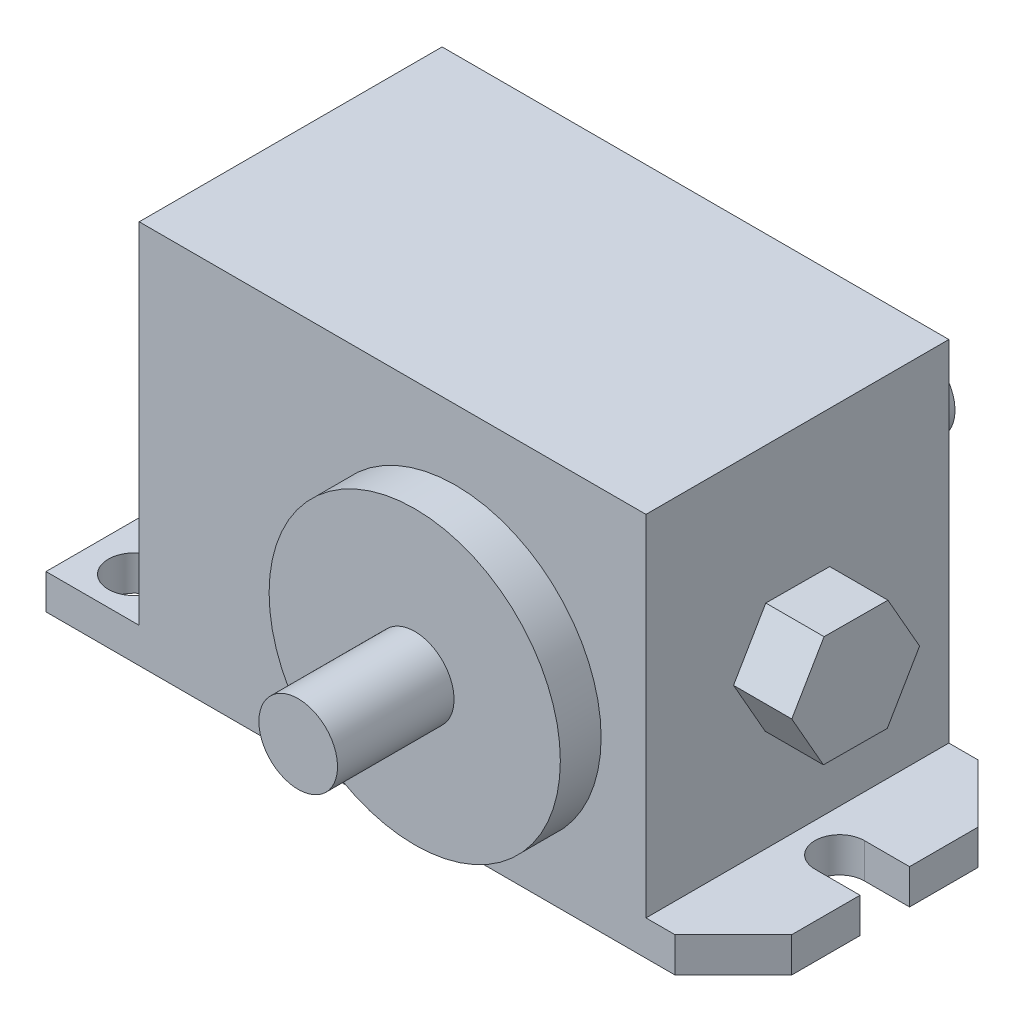
ISO-10303-21;
HEADER;
FILE_DESCRIPTION(('STEP AP214'),'2;1');
FILE_NAME('part.step','',(''),(''),'','','');
FILE_SCHEMA(('AUTOMOTIVE_DESIGN { 1 0 10303 214 1 1 1 1 }'));
ENDSEC;
DATA;
#1=APPLICATION_CONTEXT('core data for automotive mechanical design processes');
#2=APPLICATION_PROTOCOL_DEFINITION('international standard','automotive_design',2000,#1);
#3=PRODUCT_CONTEXT('',#1,'mechanical');
#4=PRODUCT('Part','Part','',(#3));
#5=PRODUCT_RELATED_PRODUCT_CATEGORY('part','',(#4));
#6=PRODUCT_DEFINITION_FORMATION('','',#4);
#7=PRODUCT_DEFINITION_CONTEXT('part definition',#1,'design');
#8=PRODUCT_DEFINITION('design','',#6,#7);
#9=PRODUCT_DEFINITION_SHAPE('','',#8);
#10=(LENGTH_UNIT() NAMED_UNIT(*) SI_UNIT(.MILLI.,.METRE.));
#11=(NAMED_UNIT(*) PLANE_ANGLE_UNIT() SI_UNIT($,.RADIAN.));
#12=(NAMED_UNIT(*) SI_UNIT($,.STERADIAN.) SOLID_ANGLE_UNIT());
#13=UNCERTAINTY_MEASURE_WITH_UNIT(LENGTH_MEASURE(1.E-05),#10,'distance_accuracy_value','');
#14=(GEOMETRIC_REPRESENTATION_CONTEXT(3) GLOBAL_UNCERTAINTY_ASSIGNED_CONTEXT((#13)) GLOBAL_UNIT_ASSIGNED_CONTEXT((#10,
#11,#12)) REPRESENTATION_CONTEXT('',''));
#15=CARTESIAN_POINT('',(0.,0.,0.));
#16=DIRECTION('',(0.,0.,1.));
#17=DIRECTION('',(1.,0.,0.));
#18=AXIS2_PLACEMENT_3D('',#15,#16,#17);
#19=CARTESIAN_POINT('',(49.,66.,-26.));
#20=DIRECTION('',(-1.,0.,0.));
#21=DIRECTION('',(0.,0.,1.));
#22=AXIS2_PLACEMENT_3D('',#19,#20,#21);
#23=PLANE('',#22);
#24=DIRECTION('',(0.,0.,-1.));
#25=VECTOR('',#24,1.);
#26=CARTESIAN_POINT('',(49.,6.,-26.));
#27=LINE('',#26,#25);
#28=CARTESIAN_POINT('',(49.,6.,26.));
#29=VERTEX_POINT('',#28);
#30=CARTESIAN_POINT('',(49.,6.,-26.));
#31=VERTEX_POINT('',#30);
#32=EDGE_CURVE('E225',#29,#31,#27,.T.);
#33=ORIENTED_EDGE('',*,*,#32,.T.);
#34=DIRECTION('',(0.,-1.,0.));
#35=VECTOR('',#34,1.);
#36=CARTESIAN_POINT('',(49.,66.,-26.));
#37=LINE('',#36,#35);
#38=CARTESIAN_POINT('',(49.,66.,-26.));
#39=VERTEX_POINT('',#38);
#40=EDGE_CURVE('E238',#39,#31,#37,.T.);
#41=ORIENTED_EDGE('',*,*,#40,.F.);
#42=DIRECTION('',(0.,0.,-1.));
#43=VECTOR('',#42,1.);
#44=CARTESIAN_POINT('',(49.,66.,-26.));
#45=LINE('',#44,#43);
#46=CARTESIAN_POINT('',(49.,66.,26.));
#47=VERTEX_POINT('',#46);
#48=EDGE_CURVE('E227',#47,#39,#45,.T.);
#49=ORIENTED_EDGE('',*,*,#48,.F.);
#50=DIRECTION('',(0.,-1.,0.));
#51=VECTOR('',#50,1.);
#52=CARTESIAN_POINT('',(49.,66.,26.));
#53=LINE('',#52,#51);
#54=EDGE_CURVE('E241',#47,#29,#53,.T.);
#55=ORIENTED_EDGE('',*,*,#54,.T.);
#56=EDGE_LOOP('',(#33,#41,#49,#55));
#57=FACE_BOUND('',#56,.T.);
#58=DIRECTION('',(0.,-0.00587887836475411,-0.999982719245274));
#59=VECTOR('',#58,1.);
#60=CARTESIAN_POINT('',(49.,23.5324088012309,5.54058211980687));
#61=LINE('',#60,#59);
#62=CARTESIAN_POINT('',(49.,23.5324088012309,5.54058211980687));
#63=VERTEX_POINT('',#62);
#64=CARTESIAN_POINT('',(49.,23.4679195331089,-5.42888343087658));
#65=VERTEX_POINT('',#64);
#66=EDGE_CURVE('E194',#63,#65,#61,.T.);
#67=ORIENTED_EDGE('',*,*,#66,.F.);
#68=DIRECTION('',(0.,-0.868949877394226,-0.494900101613001));
#69=VECTOR('',#68,1.);
#70=CARTESIAN_POINT('',(49.,33.064489268122,10.9694655506834));
#71=LINE('',#70,#69);
#72=CARTESIAN_POINT('',(49.,33.064489268122,10.9694655506834));
#73=VERTEX_POINT('',#72);
#74=EDGE_CURVE('E191',#73,#63,#71,.T.);
#75=ORIENTED_EDGE('',*,*,#74,.F.);
#76=DIRECTION('',(0.,-0.863070999029473,0.505082617632271));
#77=VECTOR('',#76,1.);
#78=CARTESIAN_POINT('',(49.,42.5320804668911,5.42888343087655));
#79=LINE('',#78,#77);
#80=CARTESIAN_POINT('',(49.,42.5320804668911,5.42888343087654));
#81=VERTEX_POINT('',#80);
#82=EDGE_CURVE('E643',#81,#73,#79,.T.);
#83=ORIENTED_EDGE('',*,*,#82,.F.);
#84=DIRECTION('',(0.,0.00587887836475347,0.999982719245274));
#85=VECTOR('',#84,1.);
#86=CARTESIAN_POINT('',(49.,42.4675911987691,-5.54058211980689));
#87=LINE('',#86,#85);
#88=CARTESIAN_POINT('',(49.,42.4675911987691,-5.54058211980689));
#89=VERTEX_POINT('',#88);
#90=EDGE_CURVE('E658',#89,#81,#87,.T.);
#91=ORIENTED_EDGE('',*,*,#90,.F.);
#92=DIRECTION('',(0.,0.868949877394226,0.494900101613002));
#93=VECTOR('',#92,1.);
#94=CARTESIAN_POINT('',(49.,32.935510731878,-10.9694655506834));
#95=LINE('',#94,#93);
#96=CARTESIAN_POINT('',(49.,32.935510731878,-10.9694655506834));
#97=VERTEX_POINT('',#96);
#98=EDGE_CURVE('E57',#97,#89,#95,.T.);
#99=ORIENTED_EDGE('',*,*,#98,.F.);
#100=DIRECTION('',(0.,0.863070999029473,-0.505082617632271));
#101=VECTOR('',#100,1.);
#102=CARTESIAN_POINT('',(49.,23.4679195331089,-5.42888343087657));
#103=LINE('',#102,#101);
#104=EDGE_CURVE('E52',#65,#97,#103,.T.);
#105=ORIENTED_EDGE('',*,*,#104,.F.);
#106=EDGE_LOOP('',(#67,#75,#83,#91,#99,#105));
#107=FACE_BOUND('',#106,.T.);
#108=ADVANCED_FACE('F35',(#57,#107),#23,.F.);
#109=CARTESIAN_POINT('',(0.,6.,0.));
#110=DIRECTION('',(0.,1.,0.));
#111=DIRECTION('',(0.,0.,1.));
#112=AXIS2_PLACEMENT_3D('',#109,#110,#111);
#113=PLANE('',#112);
#114=DIRECTION('',(0.,0.,1.));
#115=VECTOR('',#114,1.);
#116=CARTESIAN_POINT('',(-38.,6.,-26.));
#117=LINE('',#116,#115);
#118=CARTESIAN_POINT('',(-38.,6.,-26.));
#119=VERTEX_POINT('',#118);
#120=CARTESIAN_POINT('',(-38.,6.,26.));
#121=VERTEX_POINT('',#120);
#122=EDGE_CURVE('E218',#119,#121,#117,.T.);
#123=ORIENTED_EDGE('',*,*,#122,.F.);
#124=DIRECTION('',(1.,0.,0.));
#125=VECTOR('',#124,1.);
#126=CARTESIAN_POINT('',(0.,6.,-26.));
#127=LINE('',#126,#125);
#128=CARTESIAN_POINT('',(-54.,6.,-26.));
#129=VERTEX_POINT('',#128);
#130=EDGE_CURVE('E269',#129,#119,#127,.T.);
#131=ORIENTED_EDGE('',*,*,#130,.F.);
#132=DIRECTION('',(0.,0.,1.));
#133=VECTOR('',#132,1.);
#134=CARTESIAN_POINT('',(-54.,6.,0.));
#135=LINE('',#134,#133);
#136=CARTESIAN_POINT('',(-54.,6.,26.));
#137=VERTEX_POINT('',#136);
#138=EDGE_CURVE('E272',#129,#137,#135,.T.);
#139=ORIENTED_EDGE('',*,*,#138,.T.);
#140=DIRECTION('',(1.,0.,0.));
#141=VECTOR('',#140,1.);
#142=CARTESIAN_POINT('',(0.,6.,26.));
#143=LINE('',#142,#141);
#144=EDGE_CURVE('E276',#137,#121,#143,.T.);
#145=ORIENTED_EDGE('',*,*,#144,.T.);
#146=EDGE_LOOP('',(#123,#131,#139,#145));
#147=FACE_BOUND('',#146,.T.);
#148=CARTESIAN_POINT('',(-46.,6.,18.8));
#149=DIRECTION('',(0.,1.,0.));
#150=DIRECTION('',(0.,0.,1.));
#151=AXIS2_PLACEMENT_3D('',#148,#149,#150);
#152=CIRCLE('',#151,4.5);
#153=CARTESIAN_POINT('',(-46.,6.,23.3));
#154=VERTEX_POINT('',#153);
#155=EDGE_CURVE('E248',#154,#154,#152,.T.);
#156=ORIENTED_EDGE('',*,*,#155,.F.);
#157=EDGE_LOOP('',(#156));
#158=FACE_BOUND('',#157,.T.);
#159=CARTESIAN_POINT('',(-46.,6.,-18.8));
#160=DIRECTION('',(0.,1.,0.));
#161=DIRECTION('',(0.,0.,1.));
#162=AXIS2_PLACEMENT_3D('',#159,#160,#161);
#163=CIRCLE('',#162,4.5);
#164=CARTESIAN_POINT('',(-46.,6.,-14.3));
#165=VERTEX_POINT('',#164);
#166=EDGE_CURVE('E251',#165,#165,#163,.T.);
#167=ORIENTED_EDGE('',*,*,#166,.F.);
#168=EDGE_LOOP('',(#167));
#169=FACE_BOUND('',#168,.T.);
#170=ADVANCED_FACE('F407',(#147,#158,#169),#113,.T.);
#171=CARTESIAN_POINT('',(56.25,6.,0.));
#172=DIRECTION('',(0.,-1.,0.));
#173=DIRECTION('',(0.,0.,-1.));
#174=AXIS2_PLACEMENT_3D('',#171,#172,#173);
#175=CYLINDRICAL_SURFACE('',#174,4.25);
#176=CARTESIAN_POINT('',(56.25,0.,0.));
#177=DIRECTION('',(0.,1.,0.));
#178=DIRECTION('',(0.,0.,1.));
#179=AXIS2_PLACEMENT_3D('',#176,#177,#178);
#180=CIRCLE('',#179,4.25);
#181=CARTESIAN_POINT('',(56.25,0.,-4.25));
#182=VERTEX_POINT('',#181);
#183=CARTESIAN_POINT('',(56.25,0.,4.25));
#184=VERTEX_POINT('',#183);
#185=EDGE_CURVE('E289',#182,#184,#180,.T.);
#186=ORIENTED_EDGE('',*,*,#185,.F.);
#187=DIRECTION('',(0.,-1.,0.));
#188=VECTOR('',#187,1.);
#189=CARTESIAN_POINT('',(56.25,6.,-4.25));
#190=LINE('',#189,#188);
#191=CARTESIAN_POINT('',(56.25,6.,-4.25));
#192=VERTEX_POINT('',#191);
#193=EDGE_CURVE('E39',#192,#182,#190,.T.);
#194=ORIENTED_EDGE('',*,*,#193,.F.);
#195=CARTESIAN_POINT('',(56.25,6.,0.));
#196=DIRECTION('',(0.,1.,0.));
#197=DIRECTION('',(0.,0.,1.));
#198=AXIS2_PLACEMENT_3D('',#195,#196,#197);
#199=CIRCLE('',#198,4.25);
#200=CARTESIAN_POINT('',(56.25,6.,4.25));
#201=VERTEX_POINT('',#200);
#202=EDGE_CURVE('E255',#192,#201,#199,.T.);
#203=ORIENTED_EDGE('',*,*,#202,.T.);
#204=DIRECTION('',(0.,-1.,0.));
#205=VECTOR('',#204,1.);
#206=CARTESIAN_POINT('',(56.25,6.,4.25));
#207=LINE('',#206,#205);
#208=EDGE_CURVE('E283',#201,#184,#207,.T.);
#209=ORIENTED_EDGE('',*,*,#208,.T.);
#210=EDGE_LOOP('',(#186,#194,#203,#209));
#211=FACE_BOUND('',#210,.T.);
#212=ADVANCED_FACE('F342',(#211),#175,.F.);
#213=CARTESIAN_POINT('',(0.,6.,-4.24999999999999));
#214=DIRECTION('',(0.,0.,1.));
#215=DIRECTION('',(1.,0.,0.));
#216=AXIS2_PLACEMENT_3D('',#213,#214,#215);
#217=PLANE('',#216);
#218=DIRECTION('',(-1.,0.,0.));
#219=VECTOR('',#218,1.);
#220=CARTESIAN_POINT('',(0.,0.,-4.24999999999999));
#221=LINE('',#220,#219);
#222=CARTESIAN_POINT('',(64.,0.,-4.25));
#223=VERTEX_POINT('',#222);
#224=EDGE_CURVE('E292',#223,#182,#221,.T.);
#225=ORIENTED_EDGE('',*,*,#224,.F.);
#226=DIRECTION('',(0.,-1.,0.));
#227=VECTOR('',#226,1.);
#228=CARTESIAN_POINT('',(64.,6.,-4.25));
#229=LINE('',#228,#227);
#230=CARTESIAN_POINT('',(64.,6.,-4.25));
#231=VERTEX_POINT('',#230);
#232=EDGE_CURVE('E332',#231,#223,#229,.T.);
#233=ORIENTED_EDGE('',*,*,#232,.F.);
#234=DIRECTION('',(-1.,0.,0.));
#235=VECTOR('',#234,1.);
#236=CARTESIAN_POINT('',(0.,6.,-4.24999999999999));
#237=LINE('',#236,#235);
#238=EDGE_CURVE('E258',#231,#192,#237,.T.);
#239=ORIENTED_EDGE('',*,*,#238,.T.);
#240=ORIENTED_EDGE('',*,*,#193,.T.);
#241=EDGE_LOOP('',(#225,#233,#239,#240));
#242=FACE_BOUND('',#241,.T.);
#243=ADVANCED_FACE('F338',(#242),#217,.T.);
#244=CARTESIAN_POINT('',(64.,6.,0.));
#245=DIRECTION('',(1.,0.,0.));
#246=DIRECTION('',(0.,0.,-1.));
#247=AXIS2_PLACEMENT_3D('',#244,#245,#246);
#248=PLANE('',#247);
#249=DIRECTION('',(0.,0.,1.));
#250=VECTOR('',#249,1.);
#251=CARTESIAN_POINT('',(64.,0.,0.));
#252=LINE('',#251,#250);
#253=CARTESIAN_POINT('',(64.,0.,-16.));
#254=VERTEX_POINT('',#253);
#255=EDGE_CURVE('E295',#254,#223,#252,.T.);
#256=ORIENTED_EDGE('',*,*,#255,.F.);
#257=DIRECTION('',(0.,-1.,0.));
#258=VECTOR('',#257,1.);
#259=CARTESIAN_POINT('',(64.,6.,-16.));
#260=LINE('',#259,#258);
#261=CARTESIAN_POINT('',(64.,6.,-16.));
#262=VERTEX_POINT('',#261);
#263=EDGE_CURVE('E331',#262,#254,#260,.T.);
#264=ORIENTED_EDGE('',*,*,#263,.F.);
#265=DIRECTION('',(0.,0.,1.));
#266=VECTOR('',#265,1.);
#267=CARTESIAN_POINT('',(64.,6.,0.));
#268=LINE('',#267,#266);
#269=EDGE_CURVE('E261',#262,#231,#268,.T.);
#270=ORIENTED_EDGE('',*,*,#269,.T.);
#271=ORIENTED_EDGE('',*,*,#232,.T.);
#272=EDGE_LOOP('',(#256,#264,#270,#271));
#273=FACE_BOUND('',#272,.T.);
#274=ADVANCED_FACE('F347',(#273),#248,.T.);
#275=CARTESIAN_POINT('',(40.,6.,-40.));
#276=DIRECTION('',(0.707106781186548,0.,-0.707106781186547));
#277=DIRECTION('',(-0.707106781186547,0.,-0.707106781186548));
#278=AXIS2_PLACEMENT_3D('',#275,#276,#277);
#279=PLANE('',#278);
#280=DIRECTION('',(0.707106781186547,0.,0.707106781186548));
#281=VECTOR('',#280,1.);
#282=CARTESIAN_POINT('',(40.,0.,-40.));
#283=LINE('',#282,#281);
#284=CARTESIAN_POINT('',(54.,0.,-26.));
#285=VERTEX_POINT('',#284);
#286=EDGE_CURVE('E298',#285,#254,#283,.T.);
#287=ORIENTED_EDGE('',*,*,#286,.F.);
#288=DIRECTION('',(0.,-1.,0.));
#289=VECTOR('',#288,1.);
#290=CARTESIAN_POINT('',(54.,6.,-26.));
#291=LINE('',#290,#289);
#292=CARTESIAN_POINT('',(54.,6.,-26.));
#293=VERTEX_POINT('',#292);
#294=EDGE_CURVE('E329',#293,#285,#291,.T.);
#295=ORIENTED_EDGE('',*,*,#294,.F.);
#296=DIRECTION('',(0.707106781186547,0.,0.707106781186548));
#297=VECTOR('',#296,1.);
#298=CARTESIAN_POINT('',(40.,6.,-40.));
#299=LINE('',#298,#297);
#300=EDGE_CURVE('E264',#293,#262,#299,.T.);
#301=ORIENTED_EDGE('',*,*,#300,.T.);
#302=ORIENTED_EDGE('',*,*,#263,.T.);
#303=EDGE_LOOP('',(#287,#295,#301,#302));
#304=FACE_BOUND('',#303,.T.);
#305=ADVANCED_FACE('F354',(#304),#279,.T.);
#306=CARTESIAN_POINT('',(0.,6.,-26.));
#307=DIRECTION('',(0.,0.,-1.));
#308=DIRECTION('',(-1.,0.,0.));
#309=AXIS2_PLACEMENT_3D('',#306,#307,#308);
#310=PLANE('',#309);
#311=CARTESIAN_POINT('',(16.3,29.,-26.));
#312=DIRECTION('',(0.,0.,-1.));
#313=DIRECTION('',(-1.,0.,0.));
#314=AXIS2_PLACEMENT_3D('',#311,#312,#313);
#315=CIRCLE('',#314,25.);
#316=CARTESIAN_POINT('',(-8.70000000000001,29.,-26.));
#317=VERTEX_POINT('',#316);
#318=EDGE_CURVE('E44',#317,#317,#315,.T.);
#319=ORIENTED_EDGE('',*,*,#318,.F.);
#320=EDGE_LOOP('',(#319));
#321=FACE_BOUND('',#320,.T.);
#322=DIRECTION('',(1.,0.,0.));
#323=VECTOR('',#322,1.);
#324=CARTESIAN_POINT('',(0.,0.,-26.));
#325=LINE('',#324,#323);
#326=CARTESIAN_POINT('',(-54.,0.,-26.));
#327=VERTEX_POINT('',#326);
#328=EDGE_CURVE('E302',#327,#285,#325,.T.);
#329=ORIENTED_EDGE('',*,*,#328,.F.);
#330=DIRECTION('',(0.,-1.,0.));
#331=VECTOR('',#330,1.);
#332=CARTESIAN_POINT('',(-54.,6.,-26.));
#333=LINE('',#332,#331);
#334=EDGE_CURVE('E327',#129,#327,#333,.T.);
#335=ORIENTED_EDGE('',*,*,#334,.F.);
#336=ORIENTED_EDGE('',*,*,#130,.T.);
#337=DIRECTION('',(0.,-1.,0.));
#338=VECTOR('',#337,1.);
#339=CARTESIAN_POINT('',(-38.,66.,-26.));
#340=LINE('',#339,#338);
#341=CARTESIAN_POINT('',(-38.,66.,-26.));
#342=VERTEX_POINT('',#341);
#343=EDGE_CURVE('E231',#342,#119,#340,.T.);
#344=ORIENTED_EDGE('',*,*,#343,.F.);
#345=DIRECTION('',(-1.,0.,0.));
#346=VECTOR('',#345,1.);
#347=CARTESIAN_POINT('',(-38.,66.,-26.));
#348=LINE('',#347,#346);
#349=EDGE_CURVE('E229',#39,#342,#348,.T.);
#350=ORIENTED_EDGE('',*,*,#349,.F.);
#351=ORIENTED_EDGE('',*,*,#40,.T.);
#352=EDGE_CURVE('E268',#31,#293,#127,.T.);
#353=ORIENTED_EDGE('',*,*,#352,.T.);
#354=ORIENTED_EDGE('',*,*,#294,.T.);
#355=EDGE_LOOP('',(#329,#335,#336,#344,#350,#351,#353,#354));
#356=FACE_BOUND('',#355,.T.);
#357=ADVANCED_FACE('F357',(#321,#356),#310,.T.);
#358=CARTESIAN_POINT('',(-54.,6.,0.));
#359=DIRECTION('',(1.,0.,0.));
#360=DIRECTION('',(0.,0.,-1.));
#361=AXIS2_PLACEMENT_3D('',#358,#359,#360);
#362=PLANE('',#361);
#363=DIRECTION('',(0.,0.,1.));
#364=VECTOR('',#363,1.);
#365=CARTESIAN_POINT('',(-54.,0.,0.));
#366=LINE('',#365,#364);
#367=CARTESIAN_POINT('',(-54.,0.,26.));
#368=VERTEX_POINT('',#367);
#369=EDGE_CURVE('E305',#327,#368,#366,.T.);
#370=ORIENTED_EDGE('',*,*,#369,.T.);
#371=DIRECTION('',(0.,-1.,0.));
#372=VECTOR('',#371,1.);
#373=CARTESIAN_POINT('',(-54.,6.,26.));
#374=LINE('',#373,#372);
#375=EDGE_CURVE('E324',#137,#368,#374,.T.);
#376=ORIENTED_EDGE('',*,*,#375,.F.);
#377=ORIENTED_EDGE('',*,*,#138,.F.);
#378=ORIENTED_EDGE('',*,*,#334,.T.);
#379=EDGE_LOOP('',(#370,#376,#377,#378));
#380=FACE_BOUND('',#379,.T.);
#381=ADVANCED_FACE('F384',(#380),#362,.F.);
#382=CARTESIAN_POINT('',(0.,6.,26.));
#383=DIRECTION('',(0.,0.,-1.));
#384=DIRECTION('',(-1.,0.,0.));
#385=AXIS2_PLACEMENT_3D('',#382,#383,#384);
#386=PLANE('',#385);
#387=CARTESIAN_POINT('',(16.3,29.,26.));
#388=DIRECTION('',(0.,0.,-1.));
#389=DIRECTION('',(-1.,0.,0.));
#390=AXIS2_PLACEMENT_3D('',#387,#388,#389);
#391=CIRCLE('',#390,25.);
#392=CARTESIAN_POINT('',(-8.70000000000001,29.,26.));
#393=VERTEX_POINT('',#392);
#394=EDGE_CURVE('E205',#393,#393,#391,.T.);
#395=ORIENTED_EDGE('',*,*,#394,.T.);
#396=EDGE_LOOP('',(#395));
#397=FACE_BOUND('',#396,.T.);
#398=DIRECTION('',(1.,0.,0.));
#399=VECTOR('',#398,1.);
#400=CARTESIAN_POINT('',(0.,0.,26.));
#401=LINE('',#400,#399);
#402=CARTESIAN_POINT('',(54.,0.,26.));
#403=VERTEX_POINT('',#402);
#404=EDGE_CURVE('E308',#368,#403,#401,.T.);
#405=ORIENTED_EDGE('',*,*,#404,.T.);
#406=DIRECTION('',(0.,-1.,0.));
#407=VECTOR('',#406,1.);
#408=CARTESIAN_POINT('',(54.,6.,26.));
#409=LINE('',#408,#407);
#410=CARTESIAN_POINT('',(54.,6.,26.));
#411=VERTEX_POINT('',#410);
#412=EDGE_CURVE('E321',#411,#403,#409,.T.);
#413=ORIENTED_EDGE('',*,*,#412,.F.);
#414=EDGE_CURVE('E275',#29,#411,#143,.T.);
#415=ORIENTED_EDGE('',*,*,#414,.F.);
#416=ORIENTED_EDGE('',*,*,#54,.F.);
#417=DIRECTION('',(1.,0.,0.));
#418=VECTOR('',#417,1.);
#419=CARTESIAN_POINT('',(-38.,66.,26.));
#420=LINE('',#419,#418);
#421=CARTESIAN_POINT('',(-38.,66.,26.));
#422=VERTEX_POINT('',#421);
#423=EDGE_CURVE('E224',#422,#47,#420,.T.);
#424=ORIENTED_EDGE('',*,*,#423,.F.);
#425=DIRECTION('',(0.,-1.,0.));
#426=VECTOR('',#425,1.);
#427=CARTESIAN_POINT('',(-38.,66.,26.));
#428=LINE('',#427,#426);
#429=EDGE_CURVE('E244',#422,#121,#428,.T.);
#430=ORIENTED_EDGE('',*,*,#429,.T.);
#431=ORIENTED_EDGE('',*,*,#144,.F.);
#432=ORIENTED_EDGE('',*,*,#375,.T.);
#433=EDGE_LOOP('',(#405,#413,#415,#416,#424,#430,#431,#432));
#434=FACE_BOUND('',#433,.T.);
#435=ADVANCED_FACE('F365',(#397,#434),#386,.F.);
#436=CARTESIAN_POINT('',(40.,6.,40.));
#437=DIRECTION('',(-0.707106781186547,0.,-0.707106781186547));
#438=DIRECTION('',(-0.707106781186548,0.,0.707106781186548));
#439=AXIS2_PLACEMENT_3D('',#436,#437,#438);
#440=PLANE('',#439);
#441=DIRECTION('',(0.707106781186548,0.,-0.707106781186548));
#442=VECTOR('',#441,1.);
#443=CARTESIAN_POINT('',(40.,0.,40.));
#444=LINE('',#443,#442);
#445=CARTESIAN_POINT('',(64.,0.,16.));
#446=VERTEX_POINT('',#445);
#447=EDGE_CURVE('E311',#403,#446,#444,.T.);
#448=ORIENTED_EDGE('',*,*,#447,.T.);
#449=DIRECTION('',(0.,-1.,0.));
#450=VECTOR('',#449,1.);
#451=CARTESIAN_POINT('',(64.,6.,16.));
#452=LINE('',#451,#450);
#453=CARTESIAN_POINT('',(64.,6.,16.));
#454=VERTEX_POINT('',#453);
#455=EDGE_CURVE('E319',#454,#446,#452,.T.);
#456=ORIENTED_EDGE('',*,*,#455,.F.);
#457=DIRECTION('',(0.707106781186548,0.,-0.707106781186548));
#458=VECTOR('',#457,1.);
#459=CARTESIAN_POINT('',(40.,6.,40.));
#460=LINE('',#459,#458);
#461=EDGE_CURVE('E278',#411,#454,#460,.T.);
#462=ORIENTED_EDGE('',*,*,#461,.F.);
#463=ORIENTED_EDGE('',*,*,#412,.T.);
#464=EDGE_LOOP('',(#448,#456,#462,#463));
#465=FACE_BOUND('',#464,.T.);
#466=ADVANCED_FACE('F371',(#465),#440,.F.);
#467=CARTESIAN_POINT('',(64.,0.,4.25));
#468=VERTEX_POINT('',#467);
#469=EDGE_CURVE('E299',#468,#446,#252,.T.);
#470=ORIENTED_EDGE('',*,*,#469,.F.);
#471=DIRECTION('',(0.,-1.,0.));
#472=VECTOR('',#471,1.);
#473=CARTESIAN_POINT('',(64.,6.,4.25));
#474=LINE('',#473,#472);
#475=CARTESIAN_POINT('',(64.,6.,4.25));
#476=VERTEX_POINT('',#475);
#477=EDGE_CURVE('E317',#476,#468,#474,.T.);
#478=ORIENTED_EDGE('',*,*,#477,.F.);
#479=EDGE_CURVE('E265',#476,#454,#268,.T.);
#480=ORIENTED_EDGE('',*,*,#479,.T.);
#481=ORIENTED_EDGE('',*,*,#455,.T.);
#482=EDGE_LOOP('',(#470,#478,#480,#481));
#483=FACE_BOUND('',#482,.T.);
#484=ADVANCED_FACE('F376',(#483),#248,.T.);
#485=CARTESIAN_POINT('',(-46.,6.,-18.8));
#486=DIRECTION('',(0.,-1.,0.));
#487=DIRECTION('',(0.,0.,-1.));
#488=AXIS2_PLACEMENT_3D('',#485,#486,#487);
#489=CYLINDRICAL_SURFACE('',#488,4.5);
#490=ORIENTED_EDGE('',*,*,#166,.T.);
#491=EDGE_LOOP('',(#490));
#492=FACE_BOUND('',#491,.T.);
#493=CARTESIAN_POINT('',(-46.,0.,-18.8));
#494=DIRECTION('',(0.,1.,0.));
#495=DIRECTION('',(0.,0.,1.));
#496=AXIS2_PLACEMENT_3D('',#493,#494,#495);
#497=CIRCLE('',#496,4.5);
#498=CARTESIAN_POINT('',(-46.,0.,-14.3));
#499=VERTEX_POINT('',#498);
#500=EDGE_CURVE('E286',#499,#499,#497,.T.);
#501=ORIENTED_EDGE('',*,*,#500,.F.);
#502=EDGE_LOOP('',(#501));
#503=FACE_BOUND('',#502,.T.);
#504=ADVANCED_FACE('F421',(#492,#503),#489,.F.);
#505=CARTESIAN_POINT('',(-46.,6.,18.8));
#506=DIRECTION('',(0.,-1.,0.));
#507=DIRECTION('',(0.,0.,-1.));
#508=AXIS2_PLACEMENT_3D('',#505,#506,#507);
#509=CYLINDRICAL_SURFACE('',#508,4.5);
#510=ORIENTED_EDGE('',*,*,#155,.T.);
#511=EDGE_LOOP('',(#510));
#512=FACE_BOUND('',#511,.T.);
#513=CARTESIAN_POINT('',(-46.,0.,18.8));
#514=DIRECTION('',(0.,1.,0.));
#515=DIRECTION('',(0.,0.,1.));
#516=AXIS2_PLACEMENT_3D('',#513,#514,#515);
#517=CIRCLE('',#516,4.5);
#518=CARTESIAN_POINT('',(-46.,0.,23.3));
#519=VERTEX_POINT('',#518);
#520=EDGE_CURVE('E247',#519,#519,#517,.T.);
#521=ORIENTED_EDGE('',*,*,#520,.F.);
#522=EDGE_LOOP('',(#521));
#523=FACE_BOUND('',#522,.T.);
#524=ADVANCED_FACE('F37',(#512,#523),#509,.F.);
#525=CARTESIAN_POINT('',(0.,6.,4.25000000000001));
#526=DIRECTION('',(0.,0.,-1.));
#527=DIRECTION('',(-1.,0.,0.));
#528=AXIS2_PLACEMENT_3D('',#525,#526,#527);
#529=PLANE('',#528);
#530=DIRECTION('',(1.,0.,0.));
#531=VECTOR('',#530,1.);
#532=CARTESIAN_POINT('',(0.,0.,4.25000000000001));
#533=LINE('',#532,#531);
#534=EDGE_CURVE('E252',#184,#468,#533,.T.);
#535=ORIENTED_EDGE('',*,*,#534,.F.);
#536=ORIENTED_EDGE('',*,*,#208,.F.);
#537=DIRECTION('',(1.,0.,0.));
#538=VECTOR('',#537,1.);
#539=CARTESIAN_POINT('',(0.,6.,4.25000000000001));
#540=LINE('',#539,#538);
#541=EDGE_CURVE('E280',#201,#476,#540,.T.);
#542=ORIENTED_EDGE('',*,*,#541,.T.);
#543=ORIENTED_EDGE('',*,*,#477,.T.);
#544=EDGE_LOOP('',(#535,#536,#542,#543));
#545=FACE_BOUND('',#544,.T.);
#546=ADVANCED_FACE('F379',(#545),#529,.T.);
#547=ORIENTED_EDGE('',*,*,#32,.F.);
#548=ORIENTED_EDGE('',*,*,#414,.T.);
#549=ORIENTED_EDGE('',*,*,#461,.T.);
#550=ORIENTED_EDGE('',*,*,#479,.F.);
#551=ORIENTED_EDGE('',*,*,#541,.F.);
#552=ORIENTED_EDGE('',*,*,#202,.F.);
#553=ORIENTED_EDGE('',*,*,#238,.F.);
#554=ORIENTED_EDGE('',*,*,#269,.F.);
#555=ORIENTED_EDGE('',*,*,#300,.F.);
#556=ORIENTED_EDGE('',*,*,#352,.F.);
#557=EDGE_LOOP('',(#547,#548,#549,#550,#551,#552,#553,#554,#555,#556));
#558=FACE_BOUND('',#557,.T.);
#559=ADVANCED_FACE('F352',(#558),#113,.T.);
#560=CARTESIAN_POINT('',(0.,0.,0.));
#561=DIRECTION('',(0.,1.,0.));
#562=DIRECTION('',(0.,0.,1.));
#563=AXIS2_PLACEMENT_3D('',#560,#561,#562);
#564=PLANE('',#563);
#565=ORIENTED_EDGE('',*,*,#520,.T.);
#566=EDGE_LOOP('',(#565));
#567=FACE_BOUND('',#566,.T.);
#568=ORIENTED_EDGE('',*,*,#500,.T.);
#569=EDGE_LOOP('',(#568));
#570=FACE_BOUND('',#569,.T.);
#571=ORIENTED_EDGE('',*,*,#185,.T.);
#572=ORIENTED_EDGE('',*,*,#534,.T.);
#573=ORIENTED_EDGE('',*,*,#469,.T.);
#574=ORIENTED_EDGE('',*,*,#447,.F.);
#575=ORIENTED_EDGE('',*,*,#404,.F.);
#576=ORIENTED_EDGE('',*,*,#369,.F.);
#577=ORIENTED_EDGE('',*,*,#328,.T.);
#578=ORIENTED_EDGE('',*,*,#286,.T.);
#579=ORIENTED_EDGE('',*,*,#255,.T.);
#580=ORIENTED_EDGE('',*,*,#224,.T.);
#581=EDGE_LOOP('',(#571,#572,#573,#574,#575,#576,#577,#578,#579,#580));
#582=FACE_BOUND('',#581,.T.);
#583=ADVANCED_FACE('F345',(#567,#570,#582),#564,.F.);
#584=CARTESIAN_POINT('',(-38.,66.,-26.));
#585=DIRECTION('',(1.,0.,0.));
#586=DIRECTION('',(0.,0.,-1.));
#587=AXIS2_PLACEMENT_3D('',#584,#585,#586);
#588=PLANE('',#587);
#589=ORIENTED_EDGE('',*,*,#122,.T.);
#590=ORIENTED_EDGE('',*,*,#429,.F.);
#591=DIRECTION('',(0.,0.,1.));
#592=VECTOR('',#591,1.);
#593=CARTESIAN_POINT('',(-38.,66.,-26.));
#594=LINE('',#593,#592);
#595=EDGE_CURVE('E221',#342,#422,#594,.T.);
#596=ORIENTED_EDGE('',*,*,#595,.F.);
#597=ORIENTED_EDGE('',*,*,#343,.T.);
#598=EDGE_LOOP('',(#589,#590,#596,#597));
#599=FACE_BOUND('',#598,.T.);
#600=ADVANCED_FACE('F390',(#599),#588,.F.);
#601=CARTESIAN_POINT('',(0.,66.,0.));
#602=DIRECTION('',(0.,1.,0.));
#603=DIRECTION('',(0.,0.,1.));
#604=AXIS2_PLACEMENT_3D('',#601,#602,#603);
#605=PLANE('',#604);
#606=ORIENTED_EDGE('',*,*,#595,.T.);
#607=ORIENTED_EDGE('',*,*,#423,.T.);
#608=ORIENTED_EDGE('',*,*,#48,.T.);
#609=ORIENTED_EDGE('',*,*,#349,.T.);
#610=EDGE_LOOP('',(#606,#607,#608,#609));
#611=FACE_BOUND('',#610,.T.);
#612=ADVANCED_FACE('F393',(#611),#605,.T.);
#613=CARTESIAN_POINT('',(16.3,29.,-33.));
#614=DIRECTION('',(0.,0.,1.));
#615=DIRECTION('',(1.,0.,0.));
#616=AXIS2_PLACEMENT_3D('',#613,#614,#615);
#617=CYLINDRICAL_SURFACE('',#616,25.);
#618=CARTESIAN_POINT('',(16.3,29.,-33.));
#619=DIRECTION('',(0.,0.,-1.));
#620=DIRECTION('',(-1.,0.,0.));
#621=AXIS2_PLACEMENT_3D('',#618,#619,#620);
#622=CIRCLE('',#621,25.);
#623=CARTESIAN_POINT('',(-8.70000000000001,29.,-33.));
#624=VERTEX_POINT('',#623);
#625=EDGE_CURVE('E214',#624,#624,#622,.T.);
#626=ORIENTED_EDGE('',*,*,#625,.F.);
#627=EDGE_LOOP('',(#626));
#628=FACE_BOUND('',#627,.T.);
#629=ORIENTED_EDGE('',*,*,#318,.T.);
#630=EDGE_LOOP('',(#629));
#631=FACE_BOUND('',#630,.T.);
#632=ADVANCED_FACE('F395',(#628,#631),#617,.T.);
#633=CARTESIAN_POINT('',(16.3,29.,-33.));
#634=DIRECTION('',(0.,0.,-1.));
#635=DIRECTION('',(-1.,0.,0.));
#636=AXIS2_PLACEMENT_3D('',#633,#634,#635);
#637=PLANE('',#636);
#638=CARTESIAN_POINT('',(16.3,29.,-33.));
#639=DIRECTION('',(0.,0.,-1.));
#640=DIRECTION('',(-1.,0.,0.));
#641=AXIS2_PLACEMENT_3D('',#638,#639,#640);
#642=CIRCLE('',#641,6.75);
#643=CARTESIAN_POINT('',(9.54999999999999,29.,-33.));
#644=VERTEX_POINT('',#643);
#645=EDGE_CURVE('E11',#644,#644,#642,.T.);
#646=ORIENTED_EDGE('',*,*,#645,.F.);
#647=EDGE_LOOP('',(#646));
#648=FACE_BOUND('',#647,.T.);
#649=ORIENTED_EDGE('',*,*,#625,.T.);
#650=EDGE_LOOP('',(#649));
#651=FACE_BOUND('',#650,.T.);
#652=ADVANCED_FACE('F401',(#648,#651),#637,.T.);
#653=CARTESIAN_POINT('',(16.3,29.,-53.));
#654=DIRECTION('',(0.,0.,1.));
#655=DIRECTION('',(1.,0.,0.));
#656=AXIS2_PLACEMENT_3D('',#653,#654,#655);
#657=CYLINDRICAL_SURFACE('',#656,6.75);
#658=CARTESIAN_POINT('',(16.3,29.,-53.));
#659=DIRECTION('',(0.,0.,-1.));
#660=DIRECTION('',(-1.,0.,0.));
#661=AXIS2_PLACEMENT_3D('',#658,#659,#660);
#662=CIRCLE('',#661,6.75);
#663=CARTESIAN_POINT('',(9.54999999999999,29.,-53.));
#664=VERTEX_POINT('',#663);
#665=EDGE_CURVE('E210',#664,#664,#662,.T.);
#666=ORIENTED_EDGE('',*,*,#665,.F.);
#667=EDGE_LOOP('',(#666));
#668=FACE_BOUND('',#667,.T.);
#669=ORIENTED_EDGE('',*,*,#645,.T.);
#670=EDGE_LOOP('',(#669));
#671=FACE_BOUND('',#670,.T.);
#672=ADVANCED_FACE('F499',(#668,#671),#657,.T.);
#673=CARTESIAN_POINT('',(16.3,29.,-53.));
#674=DIRECTION('',(0.,0.,-1.));
#675=DIRECTION('',(-1.,0.,0.));
#676=AXIS2_PLACEMENT_3D('',#673,#674,#675);
#677=PLANE('',#676);
#678=ORIENTED_EDGE('',*,*,#665,.T.);
#679=EDGE_LOOP('',(#678));
#680=FACE_BOUND('',#679,.T.);
#681=ADVANCED_FACE('F509',(#680),#677,.T.);
#682=CARTESIAN_POINT('',(16.3,29.,33.));
#683=DIRECTION('',(0.,0.,-1.));
#684=DIRECTION('',(-1.,0.,0.));
#685=AXIS2_PLACEMENT_3D('',#682,#683,#684);
#686=CYLINDRICAL_SURFACE('',#685,25.);
#687=CARTESIAN_POINT('',(16.3,29.,33.));
#688=DIRECTION('',(0.,0.,-1.));
#689=DIRECTION('',(-1.,0.,0.));
#690=AXIS2_PLACEMENT_3D('',#687,#688,#689);
#691=CIRCLE('',#690,25.);
#692=CARTESIAN_POINT('',(-8.70000000000001,29.,33.));
#693=VERTEX_POINT('',#692);
#694=EDGE_CURVE('E207',#693,#693,#691,.T.);
#695=ORIENTED_EDGE('',*,*,#694,.T.);
#696=EDGE_LOOP('',(#695));
#697=FACE_BOUND('',#696,.T.);
#698=ORIENTED_EDGE('',*,*,#394,.F.);
#699=EDGE_LOOP('',(#698));
#700=FACE_BOUND('',#699,.T.);
#701=ADVANCED_FACE('F519',(#697,#700),#686,.T.);
#702=CARTESIAN_POINT('',(16.3,29.,33.));
#703=DIRECTION('',(0.,0.,1.));
#704=DIRECTION('',(-1.,0.,0.));
#705=AXIS2_PLACEMENT_3D('',#702,#703,#704);
#706=PLANE('',#705);
#707=CARTESIAN_POINT('',(16.3,29.,33.));
#708=DIRECTION('',(0.,0.,-1.));
#709=DIRECTION('',(-1.,0.,0.));
#710=AXIS2_PLACEMENT_3D('',#707,#708,#709);
#711=CIRCLE('',#710,6.75);
#712=CARTESIAN_POINT('',(9.54999999999999,29.,33.));
#713=VERTEX_POINT('',#712);
#714=EDGE_CURVE('E195',#713,#713,#711,.T.);
#715=ORIENTED_EDGE('',*,*,#714,.T.);
#716=EDGE_LOOP('',(#715));
#717=FACE_BOUND('',#716,.T.);
#718=ORIENTED_EDGE('',*,*,#694,.F.);
#719=EDGE_LOOP('',(#718));
#720=FACE_BOUND('',#719,.T.);
#721=ADVANCED_FACE('F535',(#717,#720),#706,.T.);
#722=CARTESIAN_POINT('',(16.3,29.,53.));
#723=DIRECTION('',(0.,0.,-1.));
#724=DIRECTION('',(-1.,0.,0.));
#725=AXIS2_PLACEMENT_3D('',#722,#723,#724);
#726=CYLINDRICAL_SURFACE('',#725,6.75);
#727=CARTESIAN_POINT('',(16.3,29.,53.));
#728=DIRECTION('',(0.,0.,-1.));
#729=DIRECTION('',(-1.,0.,0.));
#730=AXIS2_PLACEMENT_3D('',#727,#728,#729);
#731=CIRCLE('',#730,6.75);
#732=CARTESIAN_POINT('',(9.54999999999999,29.,53.));
#733=VERTEX_POINT('',#732);
#734=EDGE_CURVE('E198',#733,#733,#731,.T.);
#735=ORIENTED_EDGE('',*,*,#734,.T.);
#736=EDGE_LOOP('',(#735));
#737=FACE_BOUND('',#736,.T.);
#738=ORIENTED_EDGE('',*,*,#714,.F.);
#739=EDGE_LOOP('',(#738));
#740=FACE_BOUND('',#739,.T.);
#741=ADVANCED_FACE('F545',(#737,#740),#726,.T.);
#742=CARTESIAN_POINT('',(16.3,29.,53.));
#743=DIRECTION('',(0.,0.,1.));
#744=DIRECTION('',(-1.,0.,0.));
#745=AXIS2_PLACEMENT_3D('',#742,#743,#744);
#746=PLANE('',#745);
#747=ORIENTED_EDGE('',*,*,#734,.F.);
#748=EDGE_LOOP('',(#747));
#749=FACE_BOUND('',#748,.T.);
#750=ADVANCED_FACE('F555',(#749),#746,.T.);
#751=CARTESIAN_POINT('',(59.,23.5324088012309,5.54058211980686));
#752=DIRECTION('',(0.,0.999982719245274,-0.00587887836475411));
#753=DIRECTION('',(0.,0.00587887836475411,0.999982719245274));
#754=AXIS2_PLACEMENT_3D('',#751,#752,#753);
#755=PLANE('',#754);
#756=ORIENTED_EDGE('',*,*,#66,.T.);
#757=DIRECTION('',(-1.,0.,0.));
#758=VECTOR('',#757,1.);
#759=CARTESIAN_POINT('',(59.,23.4679195331089,-5.42888343087657));
#760=LINE('',#759,#758);
#761=CARTESIAN_POINT('',(59.,23.4679195331089,-5.42888343087657));
#762=VERTEX_POINT('',#761);
#763=EDGE_CURVE('E175',#762,#65,#760,.T.);
#764=ORIENTED_EDGE('',*,*,#763,.F.);
#765=DIRECTION('',(0.,-0.00587887836475411,-0.999982719245274));
#766=VECTOR('',#765,1.);
#767=CARTESIAN_POINT('',(59.,23.5324088012309,5.54058211980686));
#768=LINE('',#767,#766);
#769=CARTESIAN_POINT('',(59.,23.5324088012309,5.54058211980686));
#770=VERTEX_POINT('',#769);
#771=EDGE_CURVE('E182',#770,#762,#768,.T.);
#772=ORIENTED_EDGE('',*,*,#771,.F.);
#773=DIRECTION('',(-1.,0.,0.));
#774=VECTOR('',#773,1.);
#775=CARTESIAN_POINT('',(59.,23.5324088012309,5.54058211980686));
#776=LINE('',#775,#774);
#777=EDGE_CURVE('E639',#770,#63,#776,.T.);
#778=ORIENTED_EDGE('',*,*,#777,.T.);
#779=EDGE_LOOP('',(#756,#764,#772,#778));
#780=FACE_BOUND('',#779,.T.);
#781=ADVANCED_FACE('F193',(#780),#755,.F.);
#782=CARTESIAN_POINT('',(59.,23.4679195331089,-5.42888343087657));
#783=DIRECTION('',(0.,0.505082617632271,0.863070999029473));
#784=DIRECTION('',(0.,-0.863070999029473,0.505082617632271));
#785=AXIS2_PLACEMENT_3D('',#782,#783,#784);
#786=PLANE('',#785);
#787=ORIENTED_EDGE('',*,*,#104,.T.);
#788=DIRECTION('',(-1.,0.,0.));
#789=VECTOR('',#788,1.);
#790=CARTESIAN_POINT('',(59.,32.935510731878,-10.9694655506834));
#791=LINE('',#790,#789);
#792=CARTESIAN_POINT('',(59.,32.935510731878,-10.9694655506834));
#793=VERTEX_POINT('',#792);
#794=EDGE_CURVE('E178',#793,#97,#791,.T.);
#795=ORIENTED_EDGE('',*,*,#794,.F.);
#796=DIRECTION('',(0.,0.863070999029473,-0.505082617632271));
#797=VECTOR('',#796,1.);
#798=CARTESIAN_POINT('',(59.,23.4679195331089,-5.42888343087657));
#799=LINE('',#798,#797);
#800=EDGE_CURVE('E171',#762,#793,#799,.T.);
#801=ORIENTED_EDGE('',*,*,#800,.F.);
#802=ORIENTED_EDGE('',*,*,#763,.T.);
#803=EDGE_LOOP('',(#787,#795,#801,#802));
#804=FACE_BOUND('',#803,.T.);
#805=ADVANCED_FACE('F173',(#804),#786,.F.);
#806=CARTESIAN_POINT('',(59.,32.935510731878,-10.9694655506834));
#807=DIRECTION('',(0.,-0.494900101613002,0.868949877394226));
#808=DIRECTION('',(0.,-0.868949877394226,-0.494900101613002));
#809=AXIS2_PLACEMENT_3D('',#806,#807,#808);
#810=PLANE('',#809);
#811=ORIENTED_EDGE('',*,*,#98,.T.);
#812=DIRECTION('',(-1.,0.,0.));
#813=VECTOR('',#812,1.);
#814=CARTESIAN_POINT('',(59.,42.4675911987691,-5.54058211980689));
#815=LINE('',#814,#813);
#816=CARTESIAN_POINT('',(59.,42.4675911987691,-5.54058211980689));
#817=VERTEX_POINT('',#816);
#818=EDGE_CURVE('E200',#817,#89,#815,.T.);
#819=ORIENTED_EDGE('',*,*,#818,.F.);
#820=DIRECTION('',(0.,0.868949877394226,0.494900101613002));
#821=VECTOR('',#820,1.);
#822=CARTESIAN_POINT('',(59.,32.935510731878,-10.9694655506834));
#823=LINE('',#822,#821);
#824=EDGE_CURVE('E181',#793,#817,#823,.T.);
#825=ORIENTED_EDGE('',*,*,#824,.F.);
#826=ORIENTED_EDGE('',*,*,#794,.T.);
#827=EDGE_LOOP('',(#811,#819,#825,#826));
#828=FACE_BOUND('',#827,.T.);
#829=ADVANCED_FACE('F586',(#828),#810,.F.);
#830=CARTESIAN_POINT('',(59.,42.4675911987691,-5.54058211980689));
#831=DIRECTION('',(0.,-0.999982719245274,0.00587887836475347));
#832=DIRECTION('',(0.,-0.00587887836475347,-0.999982719245274));
#833=AXIS2_PLACEMENT_3D('',#830,#831,#832);
#834=PLANE('',#833);
#835=ORIENTED_EDGE('',*,*,#90,.T.);
#836=DIRECTION('',(-1.,0.,0.));
#837=VECTOR('',#836,1.);
#838=CARTESIAN_POINT('',(59.,42.5320804668911,5.42888343087655));
#839=LINE('',#838,#837);
#840=CARTESIAN_POINT('',(59.,42.5320804668911,5.42888343087655));
#841=VERTEX_POINT('',#840);
#842=EDGE_CURVE('E646',#841,#81,#839,.T.);
#843=ORIENTED_EDGE('',*,*,#842,.F.);
#844=DIRECTION('',(0.,0.00587887836475347,0.999982719245274));
#845=VECTOR('',#844,1.);
#846=CARTESIAN_POINT('',(59.,42.4675911987691,-5.54058211980689));
#847=LINE('',#846,#845);
#848=EDGE_CURVE('E659',#817,#841,#847,.T.);
#849=ORIENTED_EDGE('',*,*,#848,.F.);
#850=ORIENTED_EDGE('',*,*,#818,.T.);
#851=EDGE_LOOP('',(#835,#843,#849,#850));
#852=FACE_BOUND('',#851,.T.);
#853=ADVANCED_FACE('F595',(#852),#834,.F.);
#854=CARTESIAN_POINT('',(59.,42.5320804668911,5.42888343087655));
#855=DIRECTION('',(0.,-0.505082617632271,-0.863070999029473));
#856=DIRECTION('',(0.,0.863070999029473,-0.505082617632271));
#857=AXIS2_PLACEMENT_3D('',#854,#855,#856);
#858=PLANE('',#857);
#859=ORIENTED_EDGE('',*,*,#82,.T.);
#860=DIRECTION('',(-1.,0.,0.));
#861=VECTOR('',#860,1.);
#862=CARTESIAN_POINT('',(59.,33.064489268122,10.9694655506834));
#863=LINE('',#862,#861);
#864=CARTESIAN_POINT('',(59.,33.064489268122,10.9694655506834));
#865=VERTEX_POINT('',#864);
#866=EDGE_CURVE('E641',#865,#73,#863,.T.);
#867=ORIENTED_EDGE('',*,*,#866,.F.);
#868=DIRECTION('',(0.,-0.863070999029473,0.505082617632271));
#869=VECTOR('',#868,1.);
#870=CARTESIAN_POINT('',(59.,42.5320804668911,5.42888343087655));
#871=LINE('',#870,#869);
#872=EDGE_CURVE('E648',#841,#865,#871,.T.);
#873=ORIENTED_EDGE('',*,*,#872,.F.);
#874=ORIENTED_EDGE('',*,*,#842,.T.);
#875=EDGE_LOOP('',(#859,#867,#873,#874));
#876=FACE_BOUND('',#875,.T.);
#877=ADVANCED_FACE('F605',(#876),#858,.F.);
#878=CARTESIAN_POINT('',(59.,33.064489268122,10.9694655506834));
#879=DIRECTION('',(0.,0.494900101613001,-0.868949877394226));
#880=DIRECTION('',(0.,0.868949877394226,0.494900101613001));
#881=AXIS2_PLACEMENT_3D('',#878,#879,#880);
#882=PLANE('',#881);
#883=ORIENTED_EDGE('',*,*,#74,.T.);
#884=ORIENTED_EDGE('',*,*,#777,.F.);
#885=DIRECTION('',(0.,-0.868949877394226,-0.494900101613001));
#886=VECTOR('',#885,1.);
#887=CARTESIAN_POINT('',(59.,33.064489268122,10.9694655506834));
#888=LINE('',#887,#886);
#889=EDGE_CURVE('E187',#865,#770,#888,.T.);
#890=ORIENTED_EDGE('',*,*,#889,.F.);
#891=ORIENTED_EDGE('',*,*,#866,.T.);
#892=EDGE_LOOP('',(#883,#884,#890,#891));
#893=FACE_BOUND('',#892,.T.);
#894=ADVANCED_FACE('F615',(#893),#882,.F.);
#895=CARTESIAN_POINT('',(59.,0.,0.));
#896=DIRECTION('',(1.,0.,0.));
#897=DIRECTION('',(0.,0.,-1.));
#898=AXIS2_PLACEMENT_3D('',#895,#896,#897);
#899=PLANE('',#898);
#900=ORIENTED_EDGE('',*,*,#771,.T.);
#901=ORIENTED_EDGE('',*,*,#800,.T.);
#902=ORIENTED_EDGE('',*,*,#824,.T.);
#903=ORIENTED_EDGE('',*,*,#848,.T.);
#904=ORIENTED_EDGE('',*,*,#872,.T.);
#905=ORIENTED_EDGE('',*,*,#889,.T.);
#906=EDGE_LOOP('',(#900,#901,#902,#903,#904,#905));
#907=FACE_BOUND('',#906,.T.);
#908=ADVANCED_FACE('F185',(#907),#899,.T.);
#909=CLOSED_SHELL('',(#108,#170,#212,#243,#274,#305,#357,#381,#435,#466,#484,#504,#524,#546,
#559,#583,#600,#612,#632,#652,#672,#681,#701,#721,#741,#750,#781,#805,#829,#853,#877,#894,#908));
#910=MANIFOLD_SOLID_BREP('B2',#909);
#911=ADVANCED_BREP_SHAPE_REPRESENTATION('',(#18,#910),#14);
#912=SHAPE_DEFINITION_REPRESENTATION(#9,#911);
ENDSEC;
END-ISO-10303-21;
